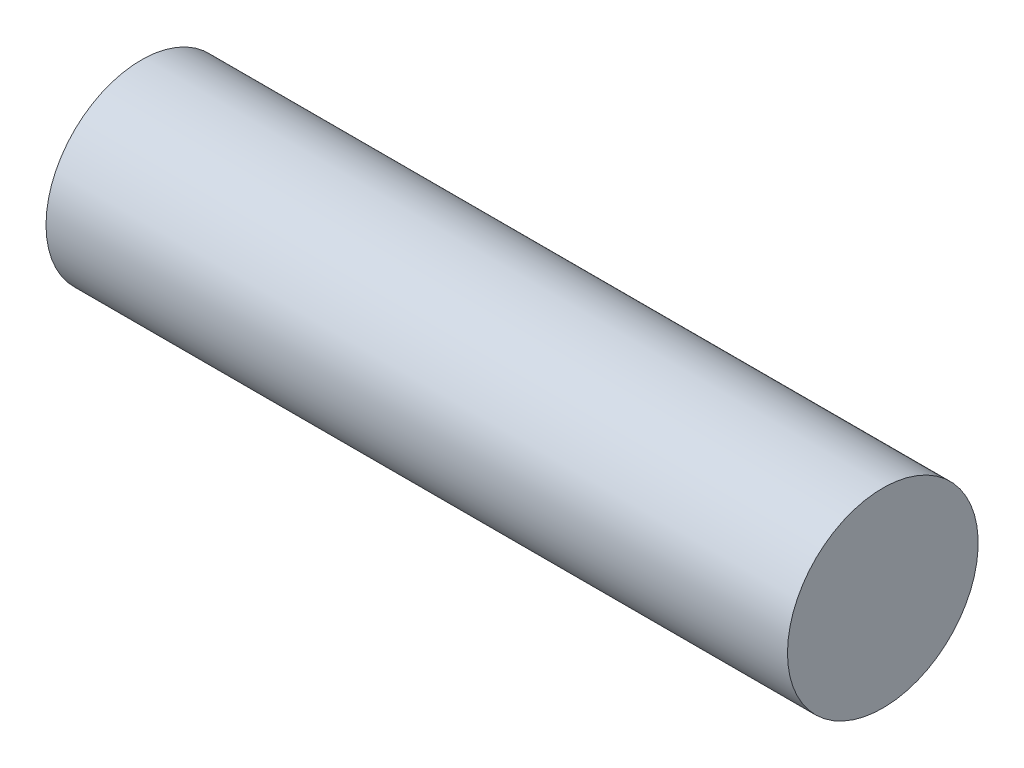
ISO-10303-21;
HEADER;
FILE_DESCRIPTION(('STEP AP214'),'2;1');
FILE_NAME('part.step','',(''),(''),'','','');
FILE_SCHEMA(('AUTOMOTIVE_DESIGN { 1 0 10303 214 1 1 1 1 }'));
ENDSEC;
DATA;
#1=APPLICATION_CONTEXT('core data for automotive mechanical design processes');
#2=APPLICATION_PROTOCOL_DEFINITION('international standard','automotive_design',2000,#1);
#3=PRODUCT_CONTEXT('',#1,'mechanical');
#4=PRODUCT('Part','Part','',(#3));
#5=PRODUCT_RELATED_PRODUCT_CATEGORY('part','',(#4));
#6=PRODUCT_DEFINITION_FORMATION('','',#4);
#7=PRODUCT_DEFINITION_CONTEXT('part definition',#1,'design');
#8=PRODUCT_DEFINITION('design','',#6,#7);
#9=PRODUCT_DEFINITION_SHAPE('','',#8);
#10=(LENGTH_UNIT() NAMED_UNIT(*) SI_UNIT(.MILLI.,.METRE.));
#11=(NAMED_UNIT(*) PLANE_ANGLE_UNIT() SI_UNIT($,.RADIAN.));
#12=(NAMED_UNIT(*) SI_UNIT($,.STERADIAN.) SOLID_ANGLE_UNIT());
#13=UNCERTAINTY_MEASURE_WITH_UNIT(LENGTH_MEASURE(1.E-05),#10,'distance_accuracy_value','');
#14=(GEOMETRIC_REPRESENTATION_CONTEXT(3) GLOBAL_UNCERTAINTY_ASSIGNED_CONTEXT((#13)) GLOBAL_UNIT_ASSIGNED_CONTEXT((#10,
#11,#12)) REPRESENTATION_CONTEXT('',''));
#15=CARTESIAN_POINT('',(0.,0.,0.));
#16=DIRECTION('',(0.,0.,1.));
#17=DIRECTION('',(1.,0.,0.));
#18=AXIS2_PLACEMENT_3D('',#15,#16,#17);
#19=CARTESIAN_POINT('',(0.,0.,0.));
#20=DIRECTION('',(-1.,0.,0.));
#21=DIRECTION('',(0.,0.,1.));
#22=AXIS2_PLACEMENT_3D('',#19,#20,#21);
#23=PLANE('',#22);
#24=CARTESIAN_POINT('',(0.,0.,0.));
#25=DIRECTION('',(-1.,0.,0.));
#26=DIRECTION('',(0.,0.,1.));
#27=AXIS2_PLACEMENT_3D('',#24,#25,#26);
#28=CIRCLE('',#27,9.);
#29=CARTESIAN_POINT('',(0.,0.,9.));
#30=VERTEX_POINT('',#29);
#31=EDGE_CURVE('E10',#30,#30,#28,.T.);
#32=ORIENTED_EDGE('',*,*,#31,.F.);
#33=EDGE_LOOP('',(#32));
#34=FACE_BOUND('',#33,.T.);
#35=ADVANCED_FACE('F33',(#34),#23,.F.);
#36=CARTESIAN_POINT('',(0.,0.,0.));
#37=DIRECTION('',(-1.,0.,0.));
#38=DIRECTION('',(0.,0.,1.));
#39=AXIS2_PLACEMENT_3D('',#36,#37,#38);
#40=CYLINDRICAL_SURFACE('',#39,8.99999999999999);
#41=CARTESIAN_POINT('',(-70.,0.,0.));
#42=DIRECTION('',(-1.,0.,0.));
#43=DIRECTION('',(0.,0.,1.));
#44=AXIS2_PLACEMENT_3D('',#41,#42,#43);
#45=CIRCLE('',#44,8.99999999999998);
#46=CARTESIAN_POINT('',(-70.,0.,8.99999999999998));
#47=VERTEX_POINT('',#46);
#48=EDGE_CURVE('E39',#47,#47,#45,.T.);
#49=ORIENTED_EDGE('',*,*,#48,.F.);
#50=EDGE_LOOP('',(#49));
#51=FACE_BOUND('',#50,.T.);
#52=ORIENTED_EDGE('',*,*,#31,.T.);
#53=EDGE_LOOP('',(#52));
#54=FACE_BOUND('',#53,.T.);
#55=ADVANCED_FACE('F47',(#51,#54),#40,.T.);
#56=CARTESIAN_POINT('',(-70.,0.,0.));
#57=DIRECTION('',(1.,0.,0.));
#58=DIRECTION('',(0.,0.,-1.));
#59=AXIS2_PLACEMENT_3D('',#56,#57,#58);
#60=PLANE('',#59);
#61=ORIENTED_EDGE('',*,*,#48,.T.);
#62=EDGE_LOOP('',(#61));
#63=FACE_BOUND('',#62,.T.);
#64=ADVANCED_FACE('F45',(#63),#60,.F.);
#65=CLOSED_SHELL('',(#35,#55,#64));
#66=MANIFOLD_SOLID_BREP('B2',#65);
#67=ADVANCED_BREP_SHAPE_REPRESENTATION('',(#18,#66),#14);
#68=SHAPE_DEFINITION_REPRESENTATION(#9,#67);
ENDSEC;
END-ISO-10303-21;
